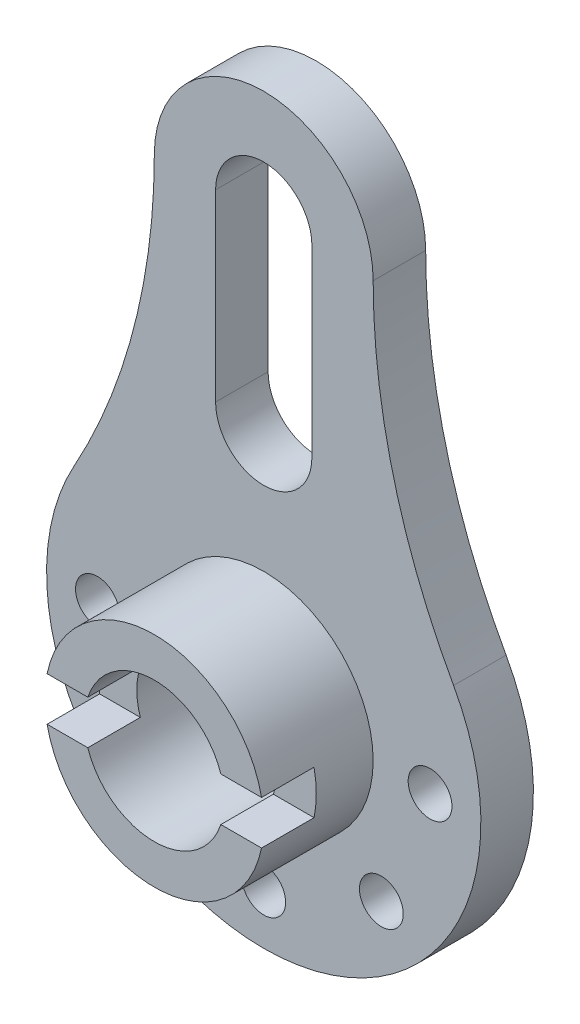
ISO-10303-21;
HEADER;
FILE_DESCRIPTION(('STEP AP214'),'2;1');
FILE_NAME('part.step','',(''),(''),'','','');
FILE_SCHEMA(('AUTOMOTIVE_DESIGN { 1 0 10303 214 1 1 1 1 }'));
ENDSEC;
DATA;
#1=APPLICATION_CONTEXT('core data for automotive mechanical design processes');
#2=APPLICATION_PROTOCOL_DEFINITION('international standard','automotive_design',2000,#1);
#3=PRODUCT_CONTEXT('',#1,'mechanical');
#4=PRODUCT('Part','Part','',(#3));
#5=PRODUCT_RELATED_PRODUCT_CATEGORY('part','',(#4));
#6=PRODUCT_DEFINITION_FORMATION('','',#4);
#7=PRODUCT_DEFINITION_CONTEXT('part definition',#1,'design');
#8=PRODUCT_DEFINITION('design','',#6,#7);
#9=PRODUCT_DEFINITION_SHAPE('','',#8);
#10=(LENGTH_UNIT() NAMED_UNIT(*) SI_UNIT(.MILLI.,.METRE.));
#11=(NAMED_UNIT(*) PLANE_ANGLE_UNIT() SI_UNIT($,.RADIAN.));
#12=(NAMED_UNIT(*) SI_UNIT($,.STERADIAN.) SOLID_ANGLE_UNIT());
#13=UNCERTAINTY_MEASURE_WITH_UNIT(LENGTH_MEASURE(1.E-05),#10,'distance_accuracy_value','');
#14=(GEOMETRIC_REPRESENTATION_CONTEXT(3) GLOBAL_UNCERTAINTY_ASSIGNED_CONTEXT((#13)) GLOBAL_UNIT_ASSIGNED_CONTEXT((#10,
#11,#12)) REPRESENTATION_CONTEXT('',''));
#15=CARTESIAN_POINT('',(0.,0.,0.));
#16=DIRECTION('',(0.,0.,1.));
#17=DIRECTION('',(1.,0.,0.));
#18=AXIS2_PLACEMENT_3D('',#15,#16,#17);
#19=CARTESIAN_POINT('',(0.,0.,37.));
#20=DIRECTION('',(0.,0.,1.));
#21=DIRECTION('',(1.,0.,0.));
#22=AXIS2_PLACEMENT_3D('',#19,#20,#21);
#23=PLANE('',#22);
#24=DIRECTION('',(-1.,0.,0.));
#25=VECTOR('',#24,1.);
#26=CARTESIAN_POINT('',(24.4948974278318,5.,37.));
#27=LINE('',#26,#25);
#28=CARTESIAN_POINT('',(24.4948974278318,5.,37.));
#29=VERTEX_POINT('',#28);
#30=CARTESIAN_POINT('',(15.1986841535707,5.,37.));
#31=VERTEX_POINT('',#30);
#32=EDGE_CURVE('E161',#29,#31,#27,.T.);
#33=ORIENTED_EDGE('',*,*,#32,.F.);
#34=CARTESIAN_POINT('',(0.,0.,37.));
#35=DIRECTION('',(0.,0.,1.));
#36=DIRECTION('',(1.,0.,0.));
#37=AXIS2_PLACEMENT_3D('',#34,#35,#36);
#38=CIRCLE('',#37,25.);
#39=CARTESIAN_POINT('',(-24.4948974278318,5.,37.));
#40=VERTEX_POINT('',#39);
#41=EDGE_CURVE('E209',#29,#40,#38,.T.);
#42=ORIENTED_EDGE('',*,*,#41,.T.);
#43=DIRECTION('',(-1.,0.,0.));
#44=VECTOR('',#43,1.);
#45=CARTESIAN_POINT('',(-24.4948974278318,5.,37.));
#46=LINE('',#45,#44);
#47=CARTESIAN_POINT('',(-15.1986841535707,5.,37.));
#48=VERTEX_POINT('',#47);
#49=EDGE_CURVE('E177',#48,#40,#46,.T.);
#50=ORIENTED_EDGE('',*,*,#49,.F.);
#51=CARTESIAN_POINT('',(0.,0.,37.));
#52=DIRECTION('',(0.,0.,1.));
#53=DIRECTION('',(1.,0.,0.));
#54=AXIS2_PLACEMENT_3D('',#51,#52,#53);
#55=CIRCLE('',#54,16.);
#56=EDGE_CURVE('E193',#31,#48,#55,.T.);
#57=ORIENTED_EDGE('',*,*,#56,.F.);
#58=EDGE_LOOP('',(#33,#42,#50,#57));
#59=FACE_BOUND('',#58,.T.);
#60=ADVANCED_FACE('F33',(#59),#23,.T.);
#61=CARTESIAN_POINT('',(-85.5,95.,12.));
#62=DIRECTION('',(0.,0.,1.));
#63=DIRECTION('',(1.,0.,0.));
#64=AXIS2_PLACEMENT_3D('',#61,#62,#63);
#65=PLANE('',#64);
#66=CARTESIAN_POINT('',(0.,0.,12.));
#67=DIRECTION('',(0.,0.,1.));
#68=DIRECTION('',(1.,0.,0.));
#69=AXIS2_PLACEMENT_3D('',#66,#67,#68);
#70=CIRCLE('',#69,25.);
#71=CARTESIAN_POINT('',(25.,0.,12.));
#72=VERTEX_POINT('',#71);
#73=EDGE_CURVE('E203',#72,#72,#70,.T.);
#74=ORIENTED_EDGE('',*,*,#73,.F.);
#75=EDGE_LOOP('',(#74));
#76=FACE_BOUND('',#75,.T.);
#77=CARTESIAN_POINT('',(26.8700576850888,-26.8700576850888,12.));
#78=DIRECTION('',(0.,0.,1.));
#79=DIRECTION('',(1.,0.,0.));
#80=AXIS2_PLACEMENT_3D('',#77,#78,#79);
#81=CIRCLE('',#80,5.);
#82=CARTESIAN_POINT('',(31.8700576850888,-26.8700576850888,12.));
#83=VERTEX_POINT('',#82);
#84=EDGE_CURVE('E208',#83,#83,#81,.T.);
#85=ORIENTED_EDGE('',*,*,#84,.F.);
#86=EDGE_LOOP('',(#85));
#87=FACE_BOUND('',#86,.T.);
#88=CARTESIAN_POINT('',(0.,-38.,12.));
#89=DIRECTION('',(0.,0.,1.));
#90=DIRECTION('',(1.,0.,0.));
#91=AXIS2_PLACEMENT_3D('',#88,#89,#90);
#92=CIRCLE('',#91,5.);
#93=CARTESIAN_POINT('',(4.99999999999999,-38.,12.));
#94=VERTEX_POINT('',#93);
#95=EDGE_CURVE('E215',#94,#94,#92,.T.);
#96=ORIENTED_EDGE('',*,*,#95,.F.);
#97=EDGE_LOOP('',(#96));
#98=FACE_BOUND('',#97,.T.);
#99=CARTESIAN_POINT('',(-26.8700576850888,-26.8700576850888,12.));
#100=DIRECTION('',(0.,0.,1.));
#101=DIRECTION('',(1.,0.,0.));
#102=AXIS2_PLACEMENT_3D('',#99,#100,#101);
#103=CIRCLE('',#102,5.);
#104=CARTESIAN_POINT('',(-21.8700576850888,-26.8700576850888,12.));
#105=VERTEX_POINT('',#104);
#106=EDGE_CURVE('E221',#105,#105,#103,.T.);
#107=ORIENTED_EDGE('',*,*,#106,.F.);
#108=EDGE_LOOP('',(#107));
#109=FACE_BOUND('',#108,.T.);
#110=CARTESIAN_POINT('',(-38.,0.,12.));
#111=DIRECTION('',(0.,0.,1.));
#112=DIRECTION('',(1.,0.,0.));
#113=AXIS2_PLACEMENT_3D('',#110,#111,#112);
#114=CIRCLE('',#113,4.99999999999994);
#115=CARTESIAN_POINT('',(-33.0000000000001,0.,12.));
#116=VERTEX_POINT('',#115);
#117=EDGE_CURVE('E227',#116,#116,#114,.F.);
#118=ORIENTED_EDGE('',*,*,#117,.T.);
#119=EDGE_LOOP('',(#118));
#120=FACE_BOUND('',#119,.T.);
#121=CARTESIAN_POINT('',(38.,0.,12.));
#122=DIRECTION('',(0.,0.,1.));
#123=DIRECTION('',(1.,0.,0.));
#124=AXIS2_PLACEMENT_3D('',#121,#122,#123);
#125=CIRCLE('',#124,5.);
#126=CARTESIAN_POINT('',(43.,0.,12.));
#127=VERTEX_POINT('',#126);
#128=EDGE_CURVE('E233',#127,#127,#125,.T.);
#129=ORIENTED_EDGE('',*,*,#128,.F.);
#130=EDGE_LOOP('',(#129));
#131=FACE_BOUND('',#130,.T.);
#132=CARTESIAN_POINT('',(-171.,95.,12.));
#133=DIRECTION('',(0.,0.,-1.));
#134=DIRECTION('',(1.,0.,0.));
#135=AXIS2_PLACEMENT_3D('',#132,#133,#134);
#136=CIRCLE('',#135,146.);
#137=CARTESIAN_POINT('',(-25.,95.,12.));
#138=VERTEX_POINT('',#137);
#139=CARTESIAN_POINT('',(-43.3730376862554,24.0961320479197,12.));
#140=VERTEX_POINT('',#139);
#141=EDGE_CURVE('E273',#138,#140,#136,.T.);
#142=ORIENTED_EDGE('',*,*,#141,.T.);
#143=CARTESIAN_POINT('',(0.,0.,12.));
#144=DIRECTION('',(0.,0.,1.));
#145=DIRECTION('',(1.,0.,0.));
#146=AXIS2_PLACEMENT_3D('',#143,#144,#145);
#147=CIRCLE('',#146,49.616972678753);
#148=CARTESIAN_POINT('',(43.3730376862554,24.0961320479197,12.));
#149=VERTEX_POINT('',#148);
#150=EDGE_CURVE('E276',#140,#149,#147,.T.);
#151=ORIENTED_EDGE('',*,*,#150,.T.);
#152=CARTESIAN_POINT('',(171.,95.,12.));
#153=DIRECTION('',(0.,0.,-1.));
#154=DIRECTION('',(-1.,0.,0.));
#155=AXIS2_PLACEMENT_3D('',#152,#153,#154);
#156=CIRCLE('',#155,146.);
#157=CARTESIAN_POINT('',(25.,95.,12.));
#158=VERTEX_POINT('',#157);
#159=EDGE_CURVE('E279',#149,#158,#156,.T.);
#160=ORIENTED_EDGE('',*,*,#159,.T.);
#161=CARTESIAN_POINT('',(0.,95.,12.));
#162=DIRECTION('',(0.,0.,1.));
#163=DIRECTION('',(1.,0.,0.));
#164=AXIS2_PLACEMENT_3D('',#161,#162,#163);
#165=CIRCLE('',#164,25.);
#166=EDGE_CURVE('E281',#158,#138,#165,.T.);
#167=ORIENTED_EDGE('',*,*,#166,.T.);
#168=EDGE_LOOP('',(#142,#151,#160,#167));
#169=FACE_BOUND('',#168,.T.);
#170=DIRECTION('',(0.,-1.,0.));
#171=VECTOR('',#170,1.);
#172=CARTESIAN_POINT('',(-11.,95.,12.));
#173=LINE('',#172,#171);
#174=CARTESIAN_POINT('',(-11.,95.,12.));
#175=VERTEX_POINT('',#174);
#176=CARTESIAN_POINT('',(-11.,53.,12.));
#177=VERTEX_POINT('',#176);
#178=EDGE_CURVE('E244',#175,#177,#173,.T.);
#179=ORIENTED_EDGE('',*,*,#178,.F.);
#180=CARTESIAN_POINT('',(0.,95.,12.));
#181=DIRECTION('',(0.,0.,1.));
#182=DIRECTION('',(1.,0.,0.));
#183=AXIS2_PLACEMENT_3D('',#180,#181,#182);
#184=CIRCLE('',#183,11.);
#185=CARTESIAN_POINT('',(11.,95.,12.));
#186=VERTEX_POINT('',#185);
#187=EDGE_CURVE('E242',#186,#175,#184,.T.);
#188=ORIENTED_EDGE('',*,*,#187,.F.);
#189=DIRECTION('',(0.,1.,0.));
#190=VECTOR('',#189,1.);
#191=CARTESIAN_POINT('',(11.,95.,12.));
#192=LINE('',#191,#190);
#193=CARTESIAN_POINT('',(11.,53.,12.));
#194=VERTEX_POINT('',#193);
#195=EDGE_CURVE('E250',#194,#186,#192,.T.);
#196=ORIENTED_EDGE('',*,*,#195,.F.);
#197=CARTESIAN_POINT('',(0.,53.,12.));
#198=DIRECTION('',(0.,0.,1.));
#199=DIRECTION('',(-1.,0.,0.));
#200=AXIS2_PLACEMENT_3D('',#197,#198,#199);
#201=CIRCLE('',#200,11.);
#202=EDGE_CURVE('E247',#177,#194,#201,.T.);
#203=ORIENTED_EDGE('',*,*,#202,.F.);
#204=EDGE_LOOP('',(#179,#188,#196,#203));
#205=FACE_BOUND('',#204,.T.);
#206=ADVANCED_FACE('F316',(#76,#87,#98,#109,#120,#131,#169,#205),#65,.T.);
#207=CARTESIAN_POINT('',(-85.5,95.,0.));
#208=DIRECTION('',(0.,0.,1.));
#209=DIRECTION('',(1.,0.,0.));
#210=AXIS2_PLACEMENT_3D('',#207,#208,#209);
#211=PLANE('',#210);
#212=CARTESIAN_POINT('',(0.,0.,0.));
#213=DIRECTION('',(0.,0.,1.));
#214=DIRECTION('',(1.,0.,0.));
#215=AXIS2_PLACEMENT_3D('',#212,#213,#214);
#216=CIRCLE('',#215,16.);
#217=CARTESIAN_POINT('',(16.,0.,0.));
#218=VERTEX_POINT('',#217);
#219=EDGE_CURVE('E200',#218,#218,#216,.T.);
#220=ORIENTED_EDGE('',*,*,#219,.T.);
#221=EDGE_LOOP('',(#220));
#222=FACE_BOUND('',#221,.T.);
#223=CARTESIAN_POINT('',(26.8700576850888,-26.8700576850888,0.));
#224=DIRECTION('',(0.,0.,1.));
#225=DIRECTION('',(1.,0.,0.));
#226=AXIS2_PLACEMENT_3D('',#223,#224,#225);
#227=CIRCLE('',#226,5.);
#228=CARTESIAN_POINT('',(31.8700576850888,-26.8700576850888,0.));
#229=VERTEX_POINT('',#228);
#230=EDGE_CURVE('E212',#229,#229,#227,.T.);
#231=ORIENTED_EDGE('',*,*,#230,.T.);
#232=EDGE_LOOP('',(#231));
#233=FACE_BOUND('',#232,.T.);
#234=CARTESIAN_POINT('',(0.,-38.,0.));
#235=DIRECTION('',(0.,0.,1.));
#236=DIRECTION('',(1.,0.,0.));
#237=AXIS2_PLACEMENT_3D('',#234,#235,#236);
#238=CIRCLE('',#237,5.);
#239=CARTESIAN_POINT('',(4.99999999999999,-38.,0.));
#240=VERTEX_POINT('',#239);
#241=EDGE_CURVE('E218',#240,#240,#238,.T.);
#242=ORIENTED_EDGE('',*,*,#241,.T.);
#243=EDGE_LOOP('',(#242));
#244=FACE_BOUND('',#243,.T.);
#245=CARTESIAN_POINT('',(-26.8700576850888,-26.8700576850888,0.));
#246=DIRECTION('',(0.,0.,1.));
#247=DIRECTION('',(1.,0.,0.));
#248=AXIS2_PLACEMENT_3D('',#245,#246,#247);
#249=CIRCLE('',#248,5.);
#250=CARTESIAN_POINT('',(-21.8700576850888,-26.8700576850888,0.));
#251=VERTEX_POINT('',#250);
#252=EDGE_CURVE('E224',#251,#251,#249,.T.);
#253=ORIENTED_EDGE('',*,*,#252,.T.);
#254=EDGE_LOOP('',(#253));
#255=FACE_BOUND('',#254,.T.);
#256=CARTESIAN_POINT('',(-38.,0.,0.));
#257=DIRECTION('',(0.,0.,1.));
#258=DIRECTION('',(1.,0.,0.));
#259=AXIS2_PLACEMENT_3D('',#256,#257,#258);
#260=CIRCLE('',#259,4.99999999999994);
#261=CARTESIAN_POINT('',(-33.0000000000001,0.,0.));
#262=VERTEX_POINT('',#261);
#263=EDGE_CURVE('E230',#262,#262,#260,.F.);
#264=ORIENTED_EDGE('',*,*,#263,.F.);
#265=EDGE_LOOP('',(#264));
#266=FACE_BOUND('',#265,.T.);
#267=CARTESIAN_POINT('',(38.,0.,0.));
#268=DIRECTION('',(0.,0.,1.));
#269=DIRECTION('',(1.,0.,0.));
#270=AXIS2_PLACEMENT_3D('',#267,#268,#269);
#271=CIRCLE('',#270,5.);
#272=CARTESIAN_POINT('',(43.,0.,0.));
#273=VERTEX_POINT('',#272);
#274=EDGE_CURVE('E236',#273,#273,#271,.T.);
#275=ORIENTED_EDGE('',*,*,#274,.T.);
#276=EDGE_LOOP('',(#275));
#277=FACE_BOUND('',#276,.T.);
#278=CARTESIAN_POINT('',(-171.,95.,0.));
#279=DIRECTION('',(0.,0.,-1.));
#280=DIRECTION('',(1.,0.,0.));
#281=AXIS2_PLACEMENT_3D('',#278,#279,#280);
#282=CIRCLE('',#281,146.);
#283=CARTESIAN_POINT('',(-25.,95.,0.));
#284=VERTEX_POINT('',#283);
#285=CARTESIAN_POINT('',(-43.3730376862554,24.0961320479197,0.));
#286=VERTEX_POINT('',#285);
#287=EDGE_CURVE('E272',#284,#286,#282,.T.);
#288=ORIENTED_EDGE('',*,*,#287,.F.);
#289=CARTESIAN_POINT('',(0.,95.,0.));
#290=DIRECTION('',(0.,0.,1.));
#291=DIRECTION('',(1.,0.,0.));
#292=AXIS2_PLACEMENT_3D('',#289,#290,#291);
#293=CIRCLE('',#292,25.);
#294=CARTESIAN_POINT('',(25.,95.,0.));
#295=VERTEX_POINT('',#294);
#296=EDGE_CURVE('E277',#295,#284,#293,.T.);
#297=ORIENTED_EDGE('',*,*,#296,.F.);
#298=CARTESIAN_POINT('',(171.,95.,0.));
#299=DIRECTION('',(0.,0.,-1.));
#300=DIRECTION('',(-1.,0.,0.));
#301=AXIS2_PLACEMENT_3D('',#298,#299,#300);
#302=CIRCLE('',#301,146.);
#303=CARTESIAN_POINT('',(43.3730376862554,24.0961320479197,0.));
#304=VERTEX_POINT('',#303);
#305=EDGE_CURVE('E288',#304,#295,#302,.T.);
#306=ORIENTED_EDGE('',*,*,#305,.F.);
#307=CARTESIAN_POINT('',(0.,0.,0.));
#308=DIRECTION('',(0.,0.,1.));
#309=DIRECTION('',(1.,0.,0.));
#310=AXIS2_PLACEMENT_3D('',#307,#308,#309);
#311=CIRCLE('',#310,49.616972678753);
#312=EDGE_CURVE('E286',#286,#304,#311,.T.);
#313=ORIENTED_EDGE('',*,*,#312,.F.);
#314=EDGE_LOOP('',(#288,#297,#306,#313));
#315=FACE_BOUND('',#314,.T.);
#316=CARTESIAN_POINT('',(0.,95.,0.));
#317=DIRECTION('',(0.,0.,1.));
#318=DIRECTION('',(1.,0.,0.));
#319=AXIS2_PLACEMENT_3D('',#316,#317,#318);
#320=CIRCLE('',#319,11.);
#321=CARTESIAN_POINT('',(11.,95.,0.));
#322=VERTEX_POINT('',#321);
#323=CARTESIAN_POINT('',(-11.,95.,0.));
#324=VERTEX_POINT('',#323);
#325=EDGE_CURVE('E239',#322,#324,#320,.T.);
#326=ORIENTED_EDGE('',*,*,#325,.T.);
#327=DIRECTION('',(0.,-1.,0.));
#328=VECTOR('',#327,1.);
#329=CARTESIAN_POINT('',(-11.,95.,0.));
#330=LINE('',#329,#328);
#331=CARTESIAN_POINT('',(-11.,53.,0.));
#332=VERTEX_POINT('',#331);
#333=EDGE_CURVE('E255',#324,#332,#330,.T.);
#334=ORIENTED_EDGE('',*,*,#333,.T.);
#335=CARTESIAN_POINT('',(0.,53.,0.));
#336=DIRECTION('',(0.,0.,1.));
#337=DIRECTION('',(-1.,0.,0.));
#338=AXIS2_PLACEMENT_3D('',#335,#336,#337);
#339=CIRCLE('',#338,11.);
#340=CARTESIAN_POINT('',(11.,53.,0.));
#341=VERTEX_POINT('',#340);
#342=EDGE_CURVE('E258',#332,#341,#339,.T.);
#343=ORIENTED_EDGE('',*,*,#342,.T.);
#344=DIRECTION('',(0.,1.,0.));
#345=VECTOR('',#344,1.);
#346=CARTESIAN_POINT('',(11.,95.,0.));
#347=LINE('',#346,#345);
#348=EDGE_CURVE('E245',#341,#322,#347,.T.);
#349=ORIENTED_EDGE('',*,*,#348,.T.);
#350=EDGE_LOOP('',(#326,#334,#343,#349));
#351=FACE_BOUND('',#350,.T.);
#352=ADVANCED_FACE('F306',(#222,#233,#244,#255,#266,#277,#315,#351),#211,.F.);
#353=CARTESIAN_POINT('',(-171.,95.,12.));
#354=DIRECTION('',(0.,0.,-1.));
#355=DIRECTION('',(-1.,0.,0.));
#356=AXIS2_PLACEMENT_3D('',#353,#354,#355);
#357=CYLINDRICAL_SURFACE('',#356,146.);
#358=ORIENTED_EDGE('',*,*,#287,.T.);
#359=DIRECTION('',(0.,0.,-1.));
#360=VECTOR('',#359,1.);
#361=CARTESIAN_POINT('',(-43.3730376862554,24.0961320479197,12.));
#362=LINE('',#361,#360);
#363=EDGE_CURVE('E11',#140,#286,#362,.T.);
#364=ORIENTED_EDGE('',*,*,#363,.F.);
#365=ORIENTED_EDGE('',*,*,#141,.F.);
#366=DIRECTION('',(0.,0.,-1.));
#367=VECTOR('',#366,1.);
#368=CARTESIAN_POINT('',(-25.,95.,12.));
#369=LINE('',#368,#367);
#370=EDGE_CURVE('E283',#138,#284,#369,.T.);
#371=ORIENTED_EDGE('',*,*,#370,.T.);
#372=EDGE_LOOP('',(#358,#364,#365,#371));
#373=FACE_BOUND('',#372,.T.);
#374=ADVANCED_FACE('F35',(#373),#357,.F.);
#375=CARTESIAN_POINT('',(0.,0.,12.));
#376=DIRECTION('',(0.,0.,-1.));
#377=DIRECTION('',(-1.,0.,0.));
#378=AXIS2_PLACEMENT_3D('',#375,#376,#377);
#379=CYLINDRICAL_SURFACE('',#378,49.616972678753);
#380=ORIENTED_EDGE('',*,*,#312,.T.);
#381=DIRECTION('',(0.,0.,-1.));
#382=VECTOR('',#381,1.);
#383=CARTESIAN_POINT('',(43.3730376862554,24.0961320479197,12.));
#384=LINE('',#383,#382);
#385=EDGE_CURVE('E41',#149,#304,#384,.T.);
#386=ORIENTED_EDGE('',*,*,#385,.F.);
#387=ORIENTED_EDGE('',*,*,#150,.F.);
#388=ORIENTED_EDGE('',*,*,#363,.T.);
#389=EDGE_LOOP('',(#380,#386,#387,#388));
#390=FACE_BOUND('',#389,.T.);
#391=ADVANCED_FACE('F318',(#390),#379,.T.);
#392=CARTESIAN_POINT('',(171.,95.,12.));
#393=DIRECTION('',(0.,0.,-1.));
#394=DIRECTION('',(-1.,0.,0.));
#395=AXIS2_PLACEMENT_3D('',#392,#393,#394);
#396=CYLINDRICAL_SURFACE('',#395,146.);
#397=ORIENTED_EDGE('',*,*,#305,.T.);
#398=DIRECTION('',(0.,0.,-1.));
#399=VECTOR('',#398,1.);
#400=CARTESIAN_POINT('',(25.,95.,12.));
#401=LINE('',#400,#399);
#402=EDGE_CURVE('E293',#158,#295,#401,.T.);
#403=ORIENTED_EDGE('',*,*,#402,.F.);
#404=ORIENTED_EDGE('',*,*,#159,.F.);
#405=ORIENTED_EDGE('',*,*,#385,.T.);
#406=EDGE_LOOP('',(#397,#403,#404,#405));
#407=FACE_BOUND('',#406,.T.);
#408=ADVANCED_FACE('F300',(#407),#396,.F.);
#409=CARTESIAN_POINT('',(0.,95.,12.));
#410=DIRECTION('',(0.,0.,-1.));
#411=DIRECTION('',(-1.,0.,0.));
#412=AXIS2_PLACEMENT_3D('',#409,#410,#411);
#413=CYLINDRICAL_SURFACE('',#412,25.);
#414=ORIENTED_EDGE('',*,*,#296,.T.);
#415=ORIENTED_EDGE('',*,*,#370,.F.);
#416=ORIENTED_EDGE('',*,*,#166,.F.);
#417=ORIENTED_EDGE('',*,*,#402,.T.);
#418=EDGE_LOOP('',(#414,#415,#416,#417));
#419=FACE_BOUND('',#418,.T.);
#420=ADVANCED_FACE('F310',(#419),#413,.T.);
#421=CARTESIAN_POINT('',(0.,95.,12.));
#422=DIRECTION('',(0.,0.,-1.));
#423=DIRECTION('',(-1.,0.,0.));
#424=AXIS2_PLACEMENT_3D('',#421,#422,#423);
#425=CYLINDRICAL_SURFACE('',#424,11.);
#426=ORIENTED_EDGE('',*,*,#325,.F.);
#427=DIRECTION('',(0.,0.,-1.));
#428=VECTOR('',#427,1.);
#429=CARTESIAN_POINT('',(11.,95.,12.));
#430=LINE('',#429,#428);
#431=EDGE_CURVE('E252',#186,#322,#430,.T.);
#432=ORIENTED_EDGE('',*,*,#431,.F.);
#433=ORIENTED_EDGE('',*,*,#187,.T.);
#434=DIRECTION('',(0.,0.,-1.));
#435=VECTOR('',#434,1.);
#436=CARTESIAN_POINT('',(-11.,95.,12.));
#437=LINE('',#436,#435);
#438=EDGE_CURVE('E269',#175,#324,#437,.T.);
#439=ORIENTED_EDGE('',*,*,#438,.T.);
#440=EDGE_LOOP('',(#426,#432,#433,#439));
#441=FACE_BOUND('',#440,.T.);
#442=ADVANCED_FACE('F524',(#441),#425,.F.);
#443=CARTESIAN_POINT('',(-11.,95.,12.));
#444=DIRECTION('',(1.,0.,0.));
#445=DIRECTION('',(0.,1.,0.));
#446=AXIS2_PLACEMENT_3D('',#443,#444,#445);
#447=PLANE('',#446);
#448=ORIENTED_EDGE('',*,*,#333,.F.);
#449=ORIENTED_EDGE('',*,*,#438,.F.);
#450=ORIENTED_EDGE('',*,*,#178,.T.);
#451=DIRECTION('',(0.,0.,-1.));
#452=VECTOR('',#451,1.);
#453=CARTESIAN_POINT('',(-11.,53.,12.));
#454=LINE('',#453,#452);
#455=EDGE_CURVE('E267',#177,#332,#454,.T.);
#456=ORIENTED_EDGE('',*,*,#455,.T.);
#457=EDGE_LOOP('',(#448,#449,#450,#456));
#458=FACE_BOUND('',#457,.T.);
#459=ADVANCED_FACE('F514',(#458),#447,.T.);
#460=CARTESIAN_POINT('',(0.,53.,12.));
#461=DIRECTION('',(0.,0.,-1.));
#462=DIRECTION('',(-1.,0.,0.));
#463=AXIS2_PLACEMENT_3D('',#460,#461,#462);
#464=CYLINDRICAL_SURFACE('',#463,11.);
#465=ORIENTED_EDGE('',*,*,#342,.F.);
#466=ORIENTED_EDGE('',*,*,#455,.F.);
#467=ORIENTED_EDGE('',*,*,#202,.T.);
#468=DIRECTION('',(0.,0.,-1.));
#469=VECTOR('',#468,1.);
#470=CARTESIAN_POINT('',(11.,53.,12.));
#471=LINE('',#470,#469);
#472=EDGE_CURVE('E265',#194,#341,#471,.T.);
#473=ORIENTED_EDGE('',*,*,#472,.T.);
#474=EDGE_LOOP('',(#465,#466,#467,#473));
#475=FACE_BOUND('',#474,.T.);
#476=ADVANCED_FACE('F504',(#475),#464,.F.);
#477=CARTESIAN_POINT('',(11.,95.,12.));
#478=DIRECTION('',(-1.,0.,0.));
#479=DIRECTION('',(0.,-1.,0.));
#480=AXIS2_PLACEMENT_3D('',#477,#478,#479);
#481=PLANE('',#480);
#482=ORIENTED_EDGE('',*,*,#348,.F.);
#483=ORIENTED_EDGE('',*,*,#472,.F.);
#484=ORIENTED_EDGE('',*,*,#195,.T.);
#485=ORIENTED_EDGE('',*,*,#431,.T.);
#486=EDGE_LOOP('',(#482,#483,#484,#485));
#487=FACE_BOUND('',#486,.T.);
#488=ADVANCED_FACE('F494',(#487),#481,.T.);
#489=CARTESIAN_POINT('',(38.,0.,0.));
#490=DIRECTION('',(0.,0.,1.));
#491=DIRECTION('',(1.,0.,0.));
#492=AXIS2_PLACEMENT_3D('',#489,#490,#491);
#493=CYLINDRICAL_SURFACE('',#492,5.);
#494=ORIENTED_EDGE('',*,*,#274,.F.);
#495=EDGE_LOOP('',(#494));
#496=FACE_BOUND('',#495,.T.);
#497=ORIENTED_EDGE('',*,*,#128,.T.);
#498=EDGE_LOOP('',(#497));
#499=FACE_BOUND('',#498,.T.);
#500=ADVANCED_FACE('F483',(#496,#499),#493,.F.);
#501=CARTESIAN_POINT('',(-38.,0.,0.));
#502=DIRECTION('',(0.,0.,1.));
#503=DIRECTION('',(1.,0.,0.));
#504=AXIS2_PLACEMENT_3D('',#501,#502,#503);
#505=CYLINDRICAL_SURFACE('',#504,4.99999999999994);
#506=ORIENTED_EDGE('',*,*,#263,.T.);
#507=EDGE_LOOP('',(#506));
#508=FACE_BOUND('',#507,.T.);
#509=ORIENTED_EDGE('',*,*,#117,.F.);
#510=EDGE_LOOP('',(#509));
#511=FACE_BOUND('',#510,.T.);
#512=ADVANCED_FACE('F473',(#508,#511),#505,.F.);
#513=CARTESIAN_POINT('',(-26.8700576850888,-26.8700576850888,0.));
#514=DIRECTION('',(0.,0.,1.));
#515=DIRECTION('',(1.,0.,0.));
#516=AXIS2_PLACEMENT_3D('',#513,#514,#515);
#517=CYLINDRICAL_SURFACE('',#516,5.);
#518=ORIENTED_EDGE('',*,*,#252,.F.);
#519=EDGE_LOOP('',(#518));
#520=FACE_BOUND('',#519,.T.);
#521=ORIENTED_EDGE('',*,*,#106,.T.);
#522=EDGE_LOOP('',(#521));
#523=FACE_BOUND('',#522,.T.);
#524=ADVANCED_FACE('F463',(#520,#523),#517,.F.);
#525=CARTESIAN_POINT('',(0.,-38.,0.));
#526=DIRECTION('',(0.,0.,1.));
#527=DIRECTION('',(1.,0.,0.));
#528=AXIS2_PLACEMENT_3D('',#525,#526,#527);
#529=CYLINDRICAL_SURFACE('',#528,5.);
#530=ORIENTED_EDGE('',*,*,#241,.F.);
#531=EDGE_LOOP('',(#530));
#532=FACE_BOUND('',#531,.T.);
#533=ORIENTED_EDGE('',*,*,#95,.T.);
#534=EDGE_LOOP('',(#533));
#535=FACE_BOUND('',#534,.T.);
#536=ADVANCED_FACE('F453',(#532,#535),#529,.F.);
#537=CARTESIAN_POINT('',(26.8700576850888,-26.8700576850888,0.));
#538=DIRECTION('',(0.,0.,1.));
#539=DIRECTION('',(1.,0.,0.));
#540=AXIS2_PLACEMENT_3D('',#537,#538,#539);
#541=CYLINDRICAL_SURFACE('',#540,5.);
#542=ORIENTED_EDGE('',*,*,#230,.F.);
#543=EDGE_LOOP('',(#542));
#544=FACE_BOUND('',#543,.T.);
#545=ORIENTED_EDGE('',*,*,#84,.T.);
#546=EDGE_LOOP('',(#545));
#547=FACE_BOUND('',#546,.T.);
#548=ADVANCED_FACE('F345',(#544,#547),#541,.F.);
#549=CARTESIAN_POINT('',(0.,0.,37.));
#550=DIRECTION('',(0.,0.,-1.));
#551=DIRECTION('',(-1.,0.,0.));
#552=AXIS2_PLACEMENT_3D('',#549,#550,#551);
#553=CYLINDRICAL_SURFACE('',#552,25.);
#554=ORIENTED_EDGE('',*,*,#41,.F.);
#555=DIRECTION('',(0.,0.,1.));
#556=VECTOR('',#555,1.);
#557=CARTESIAN_POINT('',(24.4948974278318,5.,25.));
#558=LINE('',#557,#556);
#559=CARTESIAN_POINT('',(24.4948974278318,5.,25.));
#560=VERTEX_POINT('',#559);
#561=EDGE_CURVE('E170',#560,#29,#558,.T.);
#562=ORIENTED_EDGE('',*,*,#561,.F.);
#563=CARTESIAN_POINT('',(0.,0.,25.));
#564=DIRECTION('',(0.,0.,1.));
#565=DIRECTION('',(-1.,0.,0.));
#566=AXIS2_PLACEMENT_3D('',#563,#564,#565);
#567=CIRCLE('',#566,25.);
#568=CARTESIAN_POINT('',(24.4948974278318,-5.,25.));
#569=VERTEX_POINT('',#568);
#570=EDGE_CURVE('E154',#569,#560,#567,.T.);
#571=ORIENTED_EDGE('',*,*,#570,.F.);
#572=DIRECTION('',(0.,0.,1.));
#573=VECTOR('',#572,1.);
#574=CARTESIAN_POINT('',(24.4948974278318,-5.,25.));
#575=LINE('',#574,#573);
#576=CARTESIAN_POINT('',(24.4948974278318,-5.,37.));
#577=VERTEX_POINT('',#576);
#578=EDGE_CURVE('E152',#569,#577,#575,.T.);
#579=ORIENTED_EDGE('',*,*,#578,.T.);
#580=CARTESIAN_POINT('',(-24.4948974278318,-5.,37.));
#581=VERTEX_POINT('',#580);
#582=EDGE_CURVE('E205',#581,#577,#38,.T.);
#583=ORIENTED_EDGE('',*,*,#582,.F.);
#584=DIRECTION('',(0.,0.,1.));
#585=VECTOR('',#584,1.);
#586=CARTESIAN_POINT('',(-24.4948974278318,-5.,25.));
#587=LINE('',#586,#585);
#588=CARTESIAN_POINT('',(-24.4948974278318,-5.,25.));
#589=VERTEX_POINT('',#588);
#590=EDGE_CURVE('E184',#589,#581,#587,.T.);
#591=ORIENTED_EDGE('',*,*,#590,.F.);
#592=CARTESIAN_POINT('',(0.,0.,25.));
#593=DIRECTION('',(0.,0.,1.));
#594=DIRECTION('',(1.,0.,0.));
#595=AXIS2_PLACEMENT_3D('',#592,#593,#594);
#596=CIRCLE('',#595,25.);
#597=CARTESIAN_POINT('',(-24.4948974278318,5.,25.));
#598=VERTEX_POINT('',#597);
#599=EDGE_CURVE('E175',#598,#589,#596,.T.);
#600=ORIENTED_EDGE('',*,*,#599,.F.);
#601=DIRECTION('',(0.,0.,1.));
#602=VECTOR('',#601,1.);
#603=CARTESIAN_POINT('',(-24.4948974278318,5.,25.));
#604=LINE('',#603,#602);
#605=EDGE_CURVE('E190',#598,#40,#604,.T.);
#606=ORIENTED_EDGE('',*,*,#605,.T.);
#607=EDGE_LOOP('',(#554,#562,#571,#579,#583,#591,#600,#606));
#608=FACE_BOUND('',#607,.T.);
#609=ORIENTED_EDGE('',*,*,#73,.T.);
#610=EDGE_LOOP('',(#609));
#611=FACE_BOUND('',#610,.T.);
#612=ADVANCED_FACE('F338',(#608,#611),#553,.T.);
#613=DIRECTION('',(1.,0.,0.));
#614=VECTOR('',#613,1.);
#615=CARTESIAN_POINT('',(15.1986841535707,-5.,37.));
#616=LINE('',#615,#614);
#617=CARTESIAN_POINT('',(15.1986841535707,-5.,37.));
#618=VERTEX_POINT('',#617);
#619=EDGE_CURVE('E347',#618,#577,#616,.T.);
#620=ORIENTED_EDGE('',*,*,#619,.F.);
#621=CARTESIAN_POINT('',(-15.1986841535707,-5.,37.));
#622=VERTEX_POINT('',#621);
#623=EDGE_CURVE('E168',#622,#618,#55,.T.);
#624=ORIENTED_EDGE('',*,*,#623,.F.);
#625=DIRECTION('',(1.,0.,0.));
#626=VECTOR('',#625,1.);
#627=CARTESIAN_POINT('',(-15.1986841535707,-5.,37.));
#628=LINE('',#627,#626);
#629=EDGE_CURVE('E185',#581,#622,#628,.T.);
#630=ORIENTED_EDGE('',*,*,#629,.F.);
#631=ORIENTED_EDGE('',*,*,#582,.T.);
#632=EDGE_LOOP('',(#620,#624,#630,#631));
#633=FACE_BOUND('',#632,.T.);
#634=ADVANCED_FACE('F328',(#633),#23,.T.);
#635=CARTESIAN_POINT('',(0.,0.,0.));
#636=DIRECTION('',(0.,0.,1.));
#637=DIRECTION('',(1.,0.,0.));
#638=AXIS2_PLACEMENT_3D('',#635,#636,#637);
#639=CYLINDRICAL_SURFACE('',#638,16.);
#640=CARTESIAN_POINT('',(0.,0.,25.));
#641=DIRECTION('',(0.,0.,-1.));
#642=DIRECTION('',(-1.,0.,0.));
#643=AXIS2_PLACEMENT_3D('',#640,#641,#642);
#644=CIRCLE('',#643,16.);
#645=CARTESIAN_POINT('',(15.1986841535707,5.,25.));
#646=VERTEX_POINT('',#645);
#647=CARTESIAN_POINT('',(15.1986841535707,-5.,25.));
#648=VERTEX_POINT('',#647);
#649=EDGE_CURVE('E155',#646,#648,#644,.T.);
#650=ORIENTED_EDGE('',*,*,#649,.F.);
#651=DIRECTION('',(0.,0.,1.));
#652=VECTOR('',#651,1.);
#653=CARTESIAN_POINT('',(15.1986841535707,5.,25.));
#654=LINE('',#653,#652);
#655=EDGE_CURVE('E187',#646,#31,#654,.T.);
#656=ORIENTED_EDGE('',*,*,#655,.T.);
#657=ORIENTED_EDGE('',*,*,#56,.T.);
#658=DIRECTION('',(0.,0.,1.));
#659=VECTOR('',#658,1.);
#660=CARTESIAN_POINT('',(-15.1986841535707,5.,25.));
#661=LINE('',#660,#659);
#662=CARTESIAN_POINT('',(-15.1986841535707,5.,25.));
#663=VERTEX_POINT('',#662);
#664=EDGE_CURVE('E194',#663,#48,#661,.T.);
#665=ORIENTED_EDGE('',*,*,#664,.F.);
#666=CARTESIAN_POINT('',(0.,0.,25.));
#667=DIRECTION('',(0.,0.,-1.));
#668=DIRECTION('',(1.,0.,0.));
#669=AXIS2_PLACEMENT_3D('',#666,#667,#668);
#670=CIRCLE('',#669,16.);
#671=CARTESIAN_POINT('',(-15.1986841535707,-5.,25.));
#672=VERTEX_POINT('',#671);
#673=EDGE_CURVE('E179',#672,#663,#670,.T.);
#674=ORIENTED_EDGE('',*,*,#673,.F.);
#675=DIRECTION('',(0.,0.,1.));
#676=VECTOR('',#675,1.);
#677=CARTESIAN_POINT('',(-15.1986841535707,-5.,25.));
#678=LINE('',#677,#676);
#679=EDGE_CURVE('E197',#672,#622,#678,.T.);
#680=ORIENTED_EDGE('',*,*,#679,.T.);
#681=ORIENTED_EDGE('',*,*,#623,.T.);
#682=DIRECTION('',(0.,0.,1.));
#683=VECTOR('',#682,1.);
#684=CARTESIAN_POINT('',(15.1986841535707,-5.,25.));
#685=LINE('',#684,#683);
#686=EDGE_CURVE('E149',#648,#618,#685,.T.);
#687=ORIENTED_EDGE('',*,*,#686,.F.);
#688=EDGE_LOOP('',(#650,#656,#657,#665,#674,#680,#681,#687));
#689=FACE_BOUND('',#688,.T.);
#690=ORIENTED_EDGE('',*,*,#219,.F.);
#691=EDGE_LOOP('',(#690));
#692=FACE_BOUND('',#691,.T.);
#693=ADVANCED_FACE('F164',(#689,#692),#639,.F.);
#694=CARTESIAN_POINT('',(-24.4948974278318,5.,25.));
#695=DIRECTION('',(0.,1.,0.));
#696=DIRECTION('',(-1.,0.,0.));
#697=AXIS2_PLACEMENT_3D('',#694,#695,#696);
#698=PLANE('',#697);
#699=ORIENTED_EDGE('',*,*,#49,.T.);
#700=ORIENTED_EDGE('',*,*,#605,.F.);
#701=DIRECTION('',(-1.,0.,0.));
#702=VECTOR('',#701,1.);
#703=CARTESIAN_POINT('',(-24.4948974278318,5.,25.));
#704=LINE('',#703,#702);
#705=EDGE_CURVE('E181',#663,#598,#704,.T.);
#706=ORIENTED_EDGE('',*,*,#705,.F.);
#707=ORIENTED_EDGE('',*,*,#664,.T.);
#708=EDGE_LOOP('',(#699,#700,#706,#707));
#709=FACE_BOUND('',#708,.T.);
#710=ADVANCED_FACE('F344',(#709),#698,.F.);
#711=CARTESIAN_POINT('',(-15.1986841535707,-5.,25.));
#712=DIRECTION('',(0.,-1.,0.));
#713=DIRECTION('',(1.,0.,0.));
#714=AXIS2_PLACEMENT_3D('',#711,#712,#713);
#715=PLANE('',#714);
#716=ORIENTED_EDGE('',*,*,#629,.T.);
#717=ORIENTED_EDGE('',*,*,#679,.F.);
#718=DIRECTION('',(1.,0.,0.));
#719=VECTOR('',#718,1.);
#720=CARTESIAN_POINT('',(-15.1986841535707,-5.,25.));
#721=LINE('',#720,#719);
#722=EDGE_CURVE('E56',#589,#672,#721,.T.);
#723=ORIENTED_EDGE('',*,*,#722,.F.);
#724=ORIENTED_EDGE('',*,*,#590,.T.);
#725=EDGE_LOOP('',(#716,#717,#723,#724));
#726=FACE_BOUND('',#725,.T.);
#727=ADVANCED_FACE('F369',(#726),#715,.F.);
#728=CARTESIAN_POINT('',(0.,0.,25.));
#729=DIRECTION('',(0.,0.,1.));
#730=DIRECTION('',(1.,0.,0.));
#731=AXIS2_PLACEMENT_3D('',#728,#729,#730);
#732=PLANE('',#731);
#733=ORIENTED_EDGE('',*,*,#599,.T.);
#734=ORIENTED_EDGE('',*,*,#722,.T.);
#735=ORIENTED_EDGE('',*,*,#673,.T.);
#736=ORIENTED_EDGE('',*,*,#705,.T.);
#737=EDGE_LOOP('',(#733,#734,#735,#736));
#738=FACE_BOUND('',#737,.T.);
#739=ADVANCED_FACE('F366',(#738),#732,.T.);
#740=CARTESIAN_POINT('',(24.4948974278318,5.,25.));
#741=DIRECTION('',(0.,1.,0.));
#742=DIRECTION('',(-1.,0.,0.));
#743=AXIS2_PLACEMENT_3D('',#740,#741,#742);
#744=PLANE('',#743);
#745=ORIENTED_EDGE('',*,*,#32,.T.);
#746=ORIENTED_EDGE('',*,*,#655,.F.);
#747=DIRECTION('',(-1.,0.,0.));
#748=VECTOR('',#747,1.);
#749=CARTESIAN_POINT('',(24.4948974278318,5.,25.));
#750=LINE('',#749,#748);
#751=EDGE_CURVE('E48',#560,#646,#750,.T.);
#752=ORIENTED_EDGE('',*,*,#751,.F.);
#753=ORIENTED_EDGE('',*,*,#561,.T.);
#754=EDGE_LOOP('',(#745,#746,#752,#753));
#755=FACE_BOUND('',#754,.T.);
#756=ADVANCED_FACE('F356',(#755),#744,.F.);
#757=CARTESIAN_POINT('',(15.1986841535707,-5.,25.));
#758=DIRECTION('',(0.,-1.,0.));
#759=DIRECTION('',(1.,0.,0.));
#760=AXIS2_PLACEMENT_3D('',#757,#758,#759);
#761=PLANE('',#760);
#762=ORIENTED_EDGE('',*,*,#619,.T.);
#763=ORIENTED_EDGE('',*,*,#578,.F.);
#764=DIRECTION('',(1.,0.,0.));
#765=VECTOR('',#764,1.);
#766=CARTESIAN_POINT('',(15.1986841535707,-5.,25.));
#767=LINE('',#766,#765);
#768=EDGE_CURVE('E146',#648,#569,#767,.T.);
#769=ORIENTED_EDGE('',*,*,#768,.F.);
#770=ORIENTED_EDGE('',*,*,#686,.T.);
#771=EDGE_LOOP('',(#762,#763,#769,#770));
#772=FACE_BOUND('',#771,.T.);
#773=ADVANCED_FACE('F147',(#772),#761,.F.);
#774=CARTESIAN_POINT('',(0.,0.,25.));
#775=DIRECTION('',(0.,0.,-1.));
#776=DIRECTION('',(-1.,0.,0.));
#777=AXIS2_PLACEMENT_3D('',#774,#775,#776);
#778=PLANE('',#777);
#779=ORIENTED_EDGE('',*,*,#649,.T.);
#780=ORIENTED_EDGE('',*,*,#768,.T.);
#781=ORIENTED_EDGE('',*,*,#570,.T.);
#782=ORIENTED_EDGE('',*,*,#751,.T.);
#783=EDGE_LOOP('',(#779,#780,#781,#782));
#784=FACE_BOUND('',#783,.T.);
#785=ADVANCED_FACE('F158',(#784),#778,.F.);
#786=CLOSED_SHELL('',(#60,#206,#352,#374,#391,#408,#420,#442,#459,#476,#488,#500,#512,#524,#536,
#548,#612,#634,#693,#710,#727,#739,#756,#773,#785));
#787=MANIFOLD_SOLID_BREP('B2',#786);
#788=ADVANCED_BREP_SHAPE_REPRESENTATION('',(#18,#787),#14);
#789=SHAPE_DEFINITION_REPRESENTATION(#9,#788);
ENDSEC;
END-ISO-10303-21;
